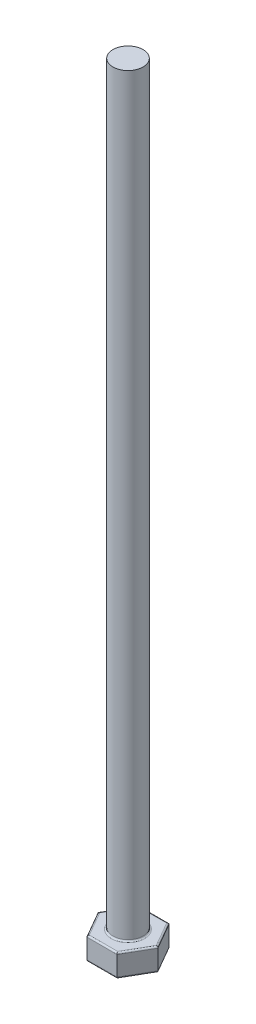
ISO-10303-21;
HEADER;
FILE_DESCRIPTION(('STEP AP214'),'2;1');
FILE_NAME('part.step','',(''),(''),'','','');
FILE_SCHEMA(('AUTOMOTIVE_DESIGN { 1 0 10303 214 1 1 1 1 }'));
ENDSEC;
DATA;
#1=APPLICATION_CONTEXT('core data for automotive mechanical design processes');
#2=APPLICATION_PROTOCOL_DEFINITION('international standard','automotive_design',2000,#1);
#3=PRODUCT_CONTEXT('',#1,'mechanical');
#4=PRODUCT('Part','Part','',(#3));
#5=PRODUCT_RELATED_PRODUCT_CATEGORY('part','',(#4));
#6=PRODUCT_DEFINITION_FORMATION('','',#4);
#7=PRODUCT_DEFINITION_CONTEXT('part definition',#1,'design');
#8=PRODUCT_DEFINITION('design','',#6,#7);
#9=PRODUCT_DEFINITION_SHAPE('','',#8);
#10=(LENGTH_UNIT() NAMED_UNIT(*) SI_UNIT(.MILLI.,.METRE.));
#11=(NAMED_UNIT(*) PLANE_ANGLE_UNIT() SI_UNIT($,.RADIAN.));
#12=(NAMED_UNIT(*) SI_UNIT($,.STERADIAN.) SOLID_ANGLE_UNIT());
#13=UNCERTAINTY_MEASURE_WITH_UNIT(LENGTH_MEASURE(1.E-05),#10,'distance_accuracy_value','');
#14=(GEOMETRIC_REPRESENTATION_CONTEXT(3) GLOBAL_UNCERTAINTY_ASSIGNED_CONTEXT((#13)) GLOBAL_UNIT_ASSIGNED_CONTEXT((#10,
#11,#12)) REPRESENTATION_CONTEXT('',''));
#15=CARTESIAN_POINT('',(0.,0.,0.));
#16=DIRECTION('',(0.,0.,1.));
#17=DIRECTION('',(1.,0.,0.));
#18=AXIS2_PLACEMENT_3D('',#15,#16,#17);
#19=CARTESIAN_POINT('',(0.,100.,0.));
#20=DIRECTION('',(0.,-1.,0.));
#21=DIRECTION('',(0.,0.,-1.));
#22=AXIS2_PLACEMENT_3D('',#19,#20,#21);
#23=CYLINDRICAL_SURFACE('',#22,2.);
#24=CARTESIAN_POINT('',(0.,0.200000000000006,0.));
#25=DIRECTION('',(0.,-1.,0.));
#26=DIRECTION('',(0.,0.,-1.));
#27=AXIS2_PLACEMENT_3D('',#24,#25,#26);
#28=CIRCLE('',#27,2.);
#29=CARTESIAN_POINT('',(0.,0.200000000000006,-2.));
#30=VERTEX_POINT('',#29);
#31=EDGE_CURVE('E11',#30,#30,#28,.F.);
#32=ORIENTED_EDGE('',*,*,#31,.T.);
#33=EDGE_LOOP('',(#32));
#34=FACE_BOUND('',#33,.T.);
#35=CARTESIAN_POINT('',(0.,100.,0.));
#36=DIRECTION('',(0.,1.,0.));
#37=DIRECTION('',(0.,0.,1.));
#38=AXIS2_PLACEMENT_3D('',#35,#36,#37);
#39=CIRCLE('',#38,2.);
#40=CARTESIAN_POINT('',(0.,100.,2.));
#41=VERTEX_POINT('',#40);
#42=EDGE_CURVE('E153',#41,#41,#39,.T.);
#43=ORIENTED_EDGE('',*,*,#42,.F.);
#44=EDGE_LOOP('',(#43));
#45=FACE_BOUND('',#44,.T.);
#46=ADVANCED_FACE('F39',(#34,#45),#23,.T.);
#47=CARTESIAN_POINT('',(0.,100.,0.));
#48=DIRECTION('',(0.,1.,0.));
#49=DIRECTION('',(0.,0.,1.));
#50=AXIS2_PLACEMENT_3D('',#47,#48,#49);
#51=PLANE('',#50);
#52=ORIENTED_EDGE('',*,*,#42,.T.);
#53=EDGE_LOOP('',(#52));
#54=FACE_BOUND('',#53,.T.);
#55=ADVANCED_FACE('F355',(#54),#51,.T.);
#56=CARTESIAN_POINT('',(1.99185842870421,-3.,-3.45));
#57=DIRECTION('',(-0.866025403784439,0.,0.5));
#58=DIRECTION('',(0.5,0.,0.866025403784439));
#59=AXIS2_PLACEMENT_3D('',#56,#57,#58);
#60=PLANE('',#59);
#61=DIRECTION('',(0.,1.,0.));
#62=VECTOR('',#61,1.);
#63=CARTESIAN_POINT('',(3.98371685740842,-3.,0.));
#64=LINE('',#63,#62);
#65=CARTESIAN_POINT('',(3.98371685740842,-2.8,0.));
#66=VERTEX_POINT('',#65);
#67=CARTESIAN_POINT('',(3.98371685740842,-0.2,0.));
#68=VERTEX_POINT('',#67);
#69=EDGE_CURVE('E282',#66,#68,#64,.T.);
#70=ORIENTED_EDGE('',*,*,#69,.F.);
#71=DIRECTION('',(0.5,0.,0.866025403784439));
#72=VECTOR('',#71,1.);
#73=CARTESIAN_POINT('',(1.99185842870421,-2.8,-3.45));
#74=LINE('',#73,#72);
#75=CARTESIAN_POINT('',(1.99185842870421,-2.8,-3.45));
#76=VERTEX_POINT('',#75);
#77=EDGE_CURVE('E199',#66,#76,#74,.F.);
#78=ORIENTED_EDGE('',*,*,#77,.T.);
#79=DIRECTION('',(0.,1.,0.));
#80=VECTOR('',#79,1.);
#81=CARTESIAN_POINT('',(1.99185842870421,-3.,-3.45));
#82=LINE('',#81,#80);
#83=CARTESIAN_POINT('',(1.99185842870421,-0.2,-3.45));
#84=VERTEX_POINT('',#83);
#85=EDGE_CURVE('E237',#76,#84,#82,.T.);
#86=ORIENTED_EDGE('',*,*,#85,.T.);
#87=DIRECTION('',(0.5,0.,0.866025403784439));
#88=VECTOR('',#87,1.);
#89=CARTESIAN_POINT('',(1.99185842870421,-0.2,-3.45));
#90=LINE('',#89,#88);
#91=EDGE_CURVE('E196',#84,#68,#90,.T.);
#92=ORIENTED_EDGE('',*,*,#91,.T.);
#93=EDGE_LOOP('',(#70,#78,#86,#92));
#94=FACE_BOUND('',#93,.T.);
#95=ADVANCED_FACE('F281',(#94),#60,.F.);
#96=CARTESIAN_POINT('',(3.98371685740842,-3.,0.));
#97=DIRECTION('',(-0.866025403784438,0.,-0.5));
#98=DIRECTION('',(-0.5,0.,0.866025403784439));
#99=AXIS2_PLACEMENT_3D('',#96,#97,#98);
#100=PLANE('',#99);
#101=DIRECTION('',(0.,1.,0.));
#102=VECTOR('',#101,1.);
#103=CARTESIAN_POINT('',(1.99185842870421,-3.,3.45));
#104=LINE('',#103,#102);
#105=CARTESIAN_POINT('',(1.99185842870421,-2.8,3.45));
#106=VERTEX_POINT('',#105);
#107=CARTESIAN_POINT('',(1.99185842870421,-0.2,3.45));
#108=VERTEX_POINT('',#107);
#109=EDGE_CURVE('E290',#106,#108,#104,.T.);
#110=ORIENTED_EDGE('',*,*,#109,.F.);
#111=DIRECTION('',(-0.5,0.,0.866025403784439));
#112=VECTOR('',#111,1.);
#113=CARTESIAN_POINT('',(3.98371685740842,-2.8,0.));
#114=LINE('',#113,#112);
#115=EDGE_CURVE('E193',#106,#66,#114,.F.);
#116=ORIENTED_EDGE('',*,*,#115,.T.);
#117=ORIENTED_EDGE('',*,*,#69,.T.);
#118=DIRECTION('',(-0.5,0.,0.866025403784439));
#119=VECTOR('',#118,1.);
#120=CARTESIAN_POINT('',(3.98371685740842,-0.2,0.));
#121=LINE('',#120,#119);
#122=EDGE_CURVE('E189',#68,#108,#121,.T.);
#123=ORIENTED_EDGE('',*,*,#122,.T.);
#124=EDGE_LOOP('',(#110,#116,#117,#123));
#125=FACE_BOUND('',#124,.T.);
#126=ADVANCED_FACE('F286',(#125),#100,.F.);
#127=CARTESIAN_POINT('',(1.99185842870421,-3.,3.45));
#128=DIRECTION('',(0.,0.,-1.));
#129=DIRECTION('',(-1.,0.,0.));
#130=AXIS2_PLACEMENT_3D('',#127,#128,#129);
#131=PLANE('',#130);
#132=DIRECTION('',(0.,1.,0.));
#133=VECTOR('',#132,1.);
#134=CARTESIAN_POINT('',(-1.99185842870421,-3.,3.45));
#135=LINE('',#134,#133);
#136=CARTESIAN_POINT('',(-1.99185842870421,-2.8,3.45));
#137=VERTEX_POINT('',#136);
#138=CARTESIAN_POINT('',(-1.99185842870421,-0.2,3.45));
#139=VERTEX_POINT('',#138);
#140=EDGE_CURVE('E296',#137,#139,#135,.T.);
#141=ORIENTED_EDGE('',*,*,#140,.F.);
#142=DIRECTION('',(-1.,0.,0.));
#143=VECTOR('',#142,1.);
#144=CARTESIAN_POINT('',(1.99185842870421,-2.8,3.45));
#145=LINE('',#144,#143);
#146=EDGE_CURVE('E186',#137,#106,#145,.F.);
#147=ORIENTED_EDGE('',*,*,#146,.T.);
#148=ORIENTED_EDGE('',*,*,#109,.T.);
#149=DIRECTION('',(-1.,0.,0.));
#150=VECTOR('',#149,1.);
#151=CARTESIAN_POINT('',(1.99185842870421,-0.2,3.45));
#152=LINE('',#151,#150);
#153=EDGE_CURVE('E183',#108,#139,#152,.T.);
#154=ORIENTED_EDGE('',*,*,#153,.T.);
#155=EDGE_LOOP('',(#141,#147,#148,#154));
#156=FACE_BOUND('',#155,.T.);
#157=ADVANCED_FACE('F385',(#156),#131,.F.);
#158=CARTESIAN_POINT('',(-1.99185842870421,-3.,3.45));
#159=DIRECTION('',(0.866025403784439,0.,-0.5));
#160=DIRECTION('',(-0.5,0.,-0.866025403784439));
#161=AXIS2_PLACEMENT_3D('',#158,#159,#160);
#162=PLANE('',#161);
#163=DIRECTION('',(0.,1.,0.));
#164=VECTOR('',#163,1.);
#165=CARTESIAN_POINT('',(-3.98371685740842,-3.,0.));
#166=LINE('',#165,#164);
#167=CARTESIAN_POINT('',(-3.98371685740842,-2.8,0.));
#168=VERTEX_POINT('',#167);
#169=CARTESIAN_POINT('',(-3.98371685740842,-0.2,0.));
#170=VERTEX_POINT('',#169);
#171=EDGE_CURVE('E325',#168,#170,#166,.T.);
#172=ORIENTED_EDGE('',*,*,#171,.F.);
#173=DIRECTION('',(-0.5,0.,-0.866025403784439));
#174=VECTOR('',#173,1.);
#175=CARTESIAN_POINT('',(-1.99185842870421,-2.8,3.45));
#176=LINE('',#175,#174);
#177=EDGE_CURVE('E180',#168,#137,#176,.F.);
#178=ORIENTED_EDGE('',*,*,#177,.T.);
#179=ORIENTED_EDGE('',*,*,#140,.T.);
#180=DIRECTION('',(-0.5,0.,-0.866025403784439));
#181=VECTOR('',#180,1.);
#182=CARTESIAN_POINT('',(-1.99185842870421,-0.2,3.45));
#183=LINE('',#182,#181);
#184=EDGE_CURVE('E177',#139,#170,#183,.T.);
#185=ORIENTED_EDGE('',*,*,#184,.T.);
#186=EDGE_LOOP('',(#172,#178,#179,#185));
#187=FACE_BOUND('',#186,.T.);
#188=ADVANCED_FACE('F335',(#187),#162,.F.);
#189=CARTESIAN_POINT('',(-3.98371685740842,-3.,0.));
#190=DIRECTION('',(0.866025403784438,0.,0.5));
#191=DIRECTION('',(0.5,0.,-0.866025403784439));
#192=AXIS2_PLACEMENT_3D('',#189,#190,#191);
#193=PLANE('',#192);
#194=DIRECTION('',(0.,1.,0.));
#195=VECTOR('',#194,1.);
#196=CARTESIAN_POINT('',(-1.99185842870421,-3.,-3.45));
#197=LINE('',#196,#195);
#198=CARTESIAN_POINT('',(-1.99185842870421,-2.8,-3.45));
#199=VERTEX_POINT('',#198);
#200=CARTESIAN_POINT('',(-1.99185842870421,-0.2,-3.45));
#201=VERTEX_POINT('',#200);
#202=EDGE_CURVE('E322',#199,#201,#197,.T.);
#203=ORIENTED_EDGE('',*,*,#202,.F.);
#204=DIRECTION('',(0.5,0.,-0.866025403784439));
#205=VECTOR('',#204,1.);
#206=CARTESIAN_POINT('',(-3.98371685740842,-2.8,0.));
#207=LINE('',#206,#205);
#208=EDGE_CURVE('E174',#199,#168,#207,.F.);
#209=ORIENTED_EDGE('',*,*,#208,.T.);
#210=ORIENTED_EDGE('',*,*,#171,.T.);
#211=DIRECTION('',(0.5,0.,-0.866025403784439));
#212=VECTOR('',#211,1.);
#213=CARTESIAN_POINT('',(-3.98371685740842,-0.2,0.));
#214=LINE('',#213,#212);
#215=EDGE_CURVE('E171',#170,#201,#214,.T.);
#216=ORIENTED_EDGE('',*,*,#215,.T.);
#217=EDGE_LOOP('',(#203,#209,#210,#216));
#218=FACE_BOUND('',#217,.T.);
#219=ADVANCED_FACE('F323',(#218),#193,.F.);
#220=CARTESIAN_POINT('',(-1.99185842870421,-3.,-3.45));
#221=DIRECTION('',(0.,0.,1.));
#222=DIRECTION('',(1.,0.,0.));
#223=AXIS2_PLACEMENT_3D('',#220,#221,#222);
#224=PLANE('',#223);
#225=ORIENTED_EDGE('',*,*,#85,.F.);
#226=DIRECTION('',(1.,0.,0.));
#227=VECTOR('',#226,1.);
#228=CARTESIAN_POINT('',(-1.99185842870421,-2.8,-3.45));
#229=LINE('',#228,#227);
#230=EDGE_CURVE('E138',#76,#199,#229,.F.);
#231=ORIENTED_EDGE('',*,*,#230,.T.);
#232=ORIENTED_EDGE('',*,*,#202,.T.);
#233=DIRECTION('',(1.,0.,0.));
#234=VECTOR('',#233,1.);
#235=CARTESIAN_POINT('',(-1.99185842870421,-0.2,-3.45));
#236=LINE('',#235,#234);
#237=EDGE_CURVE('E160',#201,#84,#236,.T.);
#238=ORIENTED_EDGE('',*,*,#237,.T.);
#239=EDGE_LOOP('',(#225,#231,#232,#238));
#240=FACE_BOUND('',#239,.T.);
#241=ADVANCED_FACE('F321',(#240),#224,.F.);
#242=CARTESIAN_POINT('',(0.,-3.,0.));
#243=DIRECTION('',(0.,-1.,0.));
#244=DIRECTION('',(0.,0.,-1.));
#245=AXIS2_PLACEMENT_3D('',#242,#243,#244);
#246=PLANE('',#245);
#247=DIRECTION('',(0.5,0.,-0.866025403784439));
#248=VECTOR('',#247,1.);
#249=CARTESIAN_POINT('',(-1.81865334794732,-3.,-3.35));
#250=LINE('',#249,#248);
#251=CARTESIAN_POINT('',(-3.75277674973257,-3.,0.));
#252=VERTEX_POINT('',#251);
#253=CARTESIAN_POINT('',(-1.87638837486628,-3.,-3.25));
#254=VERTEX_POINT('',#253);
#255=EDGE_CURVE('E157',#252,#254,#250,.T.);
#256=ORIENTED_EDGE('',*,*,#255,.T.);
#257=DIRECTION('',(1.,0.,0.));
#258=VECTOR('',#257,1.);
#259=CARTESIAN_POINT('',(1.99185842870421,-3.,-3.25));
#260=LINE('',#259,#258);
#261=CARTESIAN_POINT('',(1.87638837486628,-3.,-3.25));
#262=VERTEX_POINT('',#261);
#263=EDGE_CURVE('E136',#254,#262,#260,.T.);
#264=ORIENTED_EDGE('',*,*,#263,.T.);
#265=DIRECTION('',(0.5,0.,0.866025403784439));
#266=VECTOR('',#265,1.);
#267=CARTESIAN_POINT('',(3.81051177665153,-3.,0.100000000000001));
#268=LINE('',#267,#266);
#269=CARTESIAN_POINT('',(3.75277674973257,-3.,0.));
#270=VERTEX_POINT('',#269);
#271=EDGE_CURVE('E145',#262,#270,#268,.T.);
#272=ORIENTED_EDGE('',*,*,#271,.T.);
#273=DIRECTION('',(-0.5,0.,0.866025403784439));
#274=VECTOR('',#273,1.);
#275=CARTESIAN_POINT('',(1.81865334794732,-3.,3.35));
#276=LINE('',#275,#274);
#277=CARTESIAN_POINT('',(1.87638837486628,-3.,3.25));
#278=VERTEX_POINT('',#277);
#279=EDGE_CURVE('E152',#270,#278,#276,.T.);
#280=ORIENTED_EDGE('',*,*,#279,.T.);
#281=DIRECTION('',(-1.,0.,0.));
#282=VECTOR('',#281,1.);
#283=CARTESIAN_POINT('',(-1.99185842870421,-3.,3.25));
#284=LINE('',#283,#282);
#285=CARTESIAN_POINT('',(-1.87638837486628,-3.,3.25));
#286=VERTEX_POINT('',#285);
#287=EDGE_CURVE('E302',#278,#286,#284,.T.);
#288=ORIENTED_EDGE('',*,*,#287,.T.);
#289=DIRECTION('',(-0.5,0.,-0.866025403784439));
#290=VECTOR('',#289,1.);
#291=CARTESIAN_POINT('',(-3.81051177665153,-3.,-0.1));
#292=LINE('',#291,#290);
#293=EDGE_CURVE('E165',#286,#252,#292,.T.);
#294=ORIENTED_EDGE('',*,*,#293,.T.);
#295=EDGE_LOOP('',(#256,#264,#272,#280,#288,#294));
#296=FACE_BOUND('',#295,.T.);
#297=ADVANCED_FACE('F155',(#296),#246,.T.);
#298=CARTESIAN_POINT('',(0.,0.,0.));
#299=DIRECTION('',(0.,-1.,0.));
#300=DIRECTION('',(0.,0.,-1.));
#301=AXIS2_PLACEMENT_3D('',#298,#299,#300);
#302=PLANE('',#301);
#303=DIRECTION('',(-1.,0.,0.));
#304=VECTOR('',#303,1.);
#305=CARTESIAN_POINT('',(0.,0.,3.25));
#306=LINE('',#305,#304);
#307=CARTESIAN_POINT('',(-1.87638837486628,0.,3.25));
#308=VERTEX_POINT('',#307);
#309=CARTESIAN_POINT('',(1.87638837486628,0.,3.25));
#310=VERTEX_POINT('',#309);
#311=EDGE_CURVE('E57',#308,#310,#306,.F.);
#312=ORIENTED_EDGE('',*,*,#311,.T.);
#313=DIRECTION('',(-0.5,0.,0.866025403784439));
#314=VECTOR('',#313,1.);
#315=CARTESIAN_POINT('',(2.81458256229942,0.,1.625));
#316=LINE('',#315,#314);
#317=CARTESIAN_POINT('',(3.75277674973257,0.,0.));
#318=VERTEX_POINT('',#317);
#319=EDGE_CURVE('E49',#310,#318,#316,.F.);
#320=ORIENTED_EDGE('',*,*,#319,.T.);
#321=DIRECTION('',(0.5,0.,0.866025403784439));
#322=VECTOR('',#321,1.);
#323=CARTESIAN_POINT('',(2.81458256229943,0.,-1.625));
#324=LINE('',#323,#322);
#325=CARTESIAN_POINT('',(1.87638837486628,0.,-3.25));
#326=VERTEX_POINT('',#325);
#327=EDGE_CURVE('E206',#318,#326,#324,.F.);
#328=ORIENTED_EDGE('',*,*,#327,.T.);
#329=DIRECTION('',(1.,0.,0.));
#330=VECTOR('',#329,1.);
#331=CARTESIAN_POINT('',(0.,0.,-3.25));
#332=LINE('',#331,#330);
#333=CARTESIAN_POINT('',(-1.87638837486628,0.,-3.25));
#334=VERTEX_POINT('',#333);
#335=EDGE_CURVE('E209',#326,#334,#332,.F.);
#336=ORIENTED_EDGE('',*,*,#335,.T.);
#337=DIRECTION('',(0.5,0.,-0.866025403784439));
#338=VECTOR('',#337,1.);
#339=CARTESIAN_POINT('',(-2.81458256229942,0.,-1.625));
#340=LINE('',#339,#338);
#341=CARTESIAN_POINT('',(-3.75277674973257,0.,0.));
#342=VERTEX_POINT('',#341);
#343=EDGE_CURVE('E212',#334,#342,#340,.F.);
#344=ORIENTED_EDGE('',*,*,#343,.T.);
#345=DIRECTION('',(-0.5,0.,-0.866025403784439));
#346=VECTOR('',#345,1.);
#347=CARTESIAN_POINT('',(-2.81458256229943,0.,1.625));
#348=LINE('',#347,#346);
#349=EDGE_CURVE('E62',#342,#308,#348,.F.);
#350=ORIENTED_EDGE('',*,*,#349,.T.);
#351=EDGE_LOOP('',(#312,#320,#328,#336,#344,#350));
#352=FACE_BOUND('',#351,.T.);
#353=CARTESIAN_POINT('',(0.,0.,0.));
#354=DIRECTION('',(0.,-1.,0.));
#355=DIRECTION('',(0.,0.,-1.));
#356=AXIS2_PLACEMENT_3D('',#353,#354,#355);
#357=CIRCLE('',#356,2.2);
#358=CARTESIAN_POINT('',(0.,0.,-2.2));
#359=VERTEX_POINT('',#358);
#360=EDGE_CURVE('E202',#359,#359,#357,.T.);
#361=ORIENTED_EDGE('',*,*,#360,.T.);
#362=EDGE_LOOP('',(#361));
#363=FACE_BOUND('',#362,.T.);
#364=ADVANCED_FACE('F269',(#352,#363),#302,.F.);
#365=CARTESIAN_POINT('',(0.,-2.8,3.25));
#366=DIRECTION('',(1.,0.,0.));
#367=DIRECTION('',(0.,0.,-1.));
#368=AXIS2_PLACEMENT_3D('',#365,#366,#367);
#369=CYLINDRICAL_SURFACE('',#368,0.2);
#370=CARTESIAN_POINT('',(1.87638837486628,-2.8,3.25));
#371=DIRECTION('',(0.866025403784439,0.,-0.5));
#372=DIRECTION('',(-0.5,0.,-0.866025403784439));
#373=AXIS2_PLACEMENT_3D('',#370,#371,#372);
#374=ELLIPSE('',#373,0.23094010767585,0.2);
#375=EDGE_CURVE('E229',#106,#278,#374,.T.);
#376=ORIENTED_EDGE('',*,*,#375,.F.);
#377=ORIENTED_EDGE('',*,*,#146,.F.);
#378=CARTESIAN_POINT('',(-1.87638837486628,-2.8,3.25));
#379=DIRECTION('',(0.866025403784439,0.,0.5));
#380=DIRECTION('',(0.5,0.,-0.866025403784439));
#381=AXIS2_PLACEMENT_3D('',#378,#379,#380);
#382=ELLIPSE('',#381,0.23094010767585,0.2);
#383=EDGE_CURVE('E233',#286,#137,#382,.F.);
#384=ORIENTED_EDGE('',*,*,#383,.F.);
#385=ORIENTED_EDGE('',*,*,#287,.F.);
#386=EDGE_LOOP('',(#376,#377,#384,#385));
#387=FACE_BOUND('',#386,.T.);
#388=ADVANCED_FACE('F377',(#387),#369,.T.);
#389=CARTESIAN_POINT('',(-2.81458256229943,-2.8,1.625));
#390=DIRECTION('',(0.5,0.,0.866025403784439));
#391=DIRECTION('',(0.866025403784439,0.,-0.5));
#392=AXIS2_PLACEMENT_3D('',#389,#390,#391);
#393=CYLINDRICAL_SURFACE('',#392,0.2);
#394=ORIENTED_EDGE('',*,*,#383,.T.);
#395=ORIENTED_EDGE('',*,*,#177,.F.);
#396=CARTESIAN_POINT('',(-3.75277674973257,-2.8,0.));
#397=DIRECTION('',(0.,0.,1.));
#398=DIRECTION('',(1.,0.,0.));
#399=AXIS2_PLACEMENT_3D('',#396,#397,#398);
#400=ELLIPSE('',#399,0.23094010767585,0.2);
#401=EDGE_CURVE('E225',#252,#168,#400,.F.);
#402=ORIENTED_EDGE('',*,*,#401,.F.);
#403=ORIENTED_EDGE('',*,*,#293,.F.);
#404=EDGE_LOOP('',(#394,#395,#402,#403));
#405=FACE_BOUND('',#404,.T.);
#406=ADVANCED_FACE('F311',(#405),#393,.T.);
#407=CARTESIAN_POINT('',(2.81458256229942,-2.8,1.625));
#408=DIRECTION('',(0.5,0.,-0.866025403784439));
#409=DIRECTION('',(-0.866025403784438,0.,-0.5));
#410=AXIS2_PLACEMENT_3D('',#407,#408,#409);
#411=CYLINDRICAL_SURFACE('',#410,0.2);
#412=ORIENTED_EDGE('',*,*,#375,.T.);
#413=ORIENTED_EDGE('',*,*,#279,.F.);
#414=CARTESIAN_POINT('',(3.75277674973257,-2.8,0.));
#415=DIRECTION('',(0.,0.,-1.));
#416=DIRECTION('',(-1.,0.,0.));
#417=AXIS2_PLACEMENT_3D('',#414,#415,#416);
#418=ELLIPSE('',#417,0.23094010767585,0.2);
#419=EDGE_CURVE('E148',#66,#270,#418,.T.);
#420=ORIENTED_EDGE('',*,*,#419,.F.);
#421=ORIENTED_EDGE('',*,*,#115,.F.);
#422=EDGE_LOOP('',(#412,#413,#420,#421));
#423=FACE_BOUND('',#422,.T.);
#424=ADVANCED_FACE('F372',(#423),#411,.T.);
#425=CARTESIAN_POINT('',(-2.81458256229942,-2.8,-1.625));
#426=DIRECTION('',(-0.5,0.,0.866025403784439));
#427=DIRECTION('',(0.866025403784438,0.,0.5));
#428=AXIS2_PLACEMENT_3D('',#425,#426,#427);
#429=CYLINDRICAL_SURFACE('',#428,0.2);
#430=ORIENTED_EDGE('',*,*,#401,.T.);
#431=ORIENTED_EDGE('',*,*,#208,.F.);
#432=CARTESIAN_POINT('',(-1.87638837486628,-2.8,-3.25));
#433=DIRECTION('',(-0.866025403784439,0.,0.5));
#434=DIRECTION('',(0.5,0.,0.866025403784439));
#435=AXIS2_PLACEMENT_3D('',#432,#433,#434);
#436=ELLIPSE('',#435,0.23094010767585,0.2);
#437=EDGE_CURVE('E142',#254,#199,#436,.F.);
#438=ORIENTED_EDGE('',*,*,#437,.F.);
#439=ORIENTED_EDGE('',*,*,#255,.F.);
#440=EDGE_LOOP('',(#430,#431,#438,#439));
#441=FACE_BOUND('',#440,.T.);
#442=ADVANCED_FACE('F314',(#441),#429,.T.);
#443=CARTESIAN_POINT('',(2.81458256229943,-2.8,-1.625));
#444=DIRECTION('',(-0.5,0.,-0.866025403784439));
#445=DIRECTION('',(-0.866025403784439,0.,0.5));
#446=AXIS2_PLACEMENT_3D('',#443,#444,#445);
#447=CYLINDRICAL_SURFACE('',#446,0.2);
#448=ORIENTED_EDGE('',*,*,#419,.T.);
#449=ORIENTED_EDGE('',*,*,#271,.F.);
#450=CARTESIAN_POINT('',(1.87638837486628,-2.8,-3.25));
#451=DIRECTION('',(-0.866025403784439,0.,-0.5));
#452=DIRECTION('',(0.5,0.,-0.866025403784439));
#453=AXIS2_PLACEMENT_3D('',#450,#451,#452);
#454=ELLIPSE('',#453,0.23094010767585,0.2);
#455=EDGE_CURVE('E132',#76,#262,#454,.T.);
#456=ORIENTED_EDGE('',*,*,#455,.F.);
#457=ORIENTED_EDGE('',*,*,#77,.F.);
#458=EDGE_LOOP('',(#448,#449,#456,#457));
#459=FACE_BOUND('',#458,.T.);
#460=ADVANCED_FACE('F146',(#459),#447,.T.);
#461=CARTESIAN_POINT('',(0.,-2.8,-3.25));
#462=DIRECTION('',(-1.,0.,0.));
#463=DIRECTION('',(0.,0.,1.));
#464=AXIS2_PLACEMENT_3D('',#461,#462,#463);
#465=CYLINDRICAL_SURFACE('',#464,0.2);
#466=ORIENTED_EDGE('',*,*,#437,.T.);
#467=ORIENTED_EDGE('',*,*,#230,.F.);
#468=ORIENTED_EDGE('',*,*,#455,.T.);
#469=ORIENTED_EDGE('',*,*,#263,.F.);
#470=EDGE_LOOP('',(#466,#467,#468,#469));
#471=FACE_BOUND('',#470,.T.);
#472=ADVANCED_FACE('F134',(#471),#465,.T.);
#473=CARTESIAN_POINT('',(-3.81051177665153,-0.2,0.1));
#474=DIRECTION('',(0.5,0.,-0.866025403784439));
#475=DIRECTION('',(-0.866025403784438,0.,-0.5));
#476=AXIS2_PLACEMENT_3D('',#473,#474,#475);
#477=CYLINDRICAL_SURFACE('',#476,0.2);
#478=CARTESIAN_POINT('',(-3.75277674973257,-0.2,0.));
#479=DIRECTION('',(0.,0.,-1.));
#480=DIRECTION('',(1.,0.,0.));
#481=AXIS2_PLACEMENT_3D('',#478,#479,#480);
#482=ELLIPSE('',#481,0.23094010767585,0.2);
#483=EDGE_CURVE('E251',#342,#170,#482,.F.);
#484=ORIENTED_EDGE('',*,*,#483,.F.);
#485=ORIENTED_EDGE('',*,*,#343,.F.);
#486=CARTESIAN_POINT('',(-1.87638837486628,-0.2,-3.25));
#487=DIRECTION('',(0.866025403784439,0.,-0.5));
#488=DIRECTION('',(0.5,0.,0.866025403784439));
#489=AXIS2_PLACEMENT_3D('',#486,#487,#488);
#490=ELLIPSE('',#489,0.23094010767585,0.2);
#491=EDGE_CURVE('E43',#201,#334,#490,.T.);
#492=ORIENTED_EDGE('',*,*,#491,.F.);
#493=ORIENTED_EDGE('',*,*,#215,.F.);
#494=EDGE_LOOP('',(#484,#485,#492,#493));
#495=FACE_BOUND('',#494,.T.);
#496=ADVANCED_FACE('F268',(#495),#477,.T.);
#497=CARTESIAN_POINT('',(-1.99185842870421,-0.2,-3.25));
#498=DIRECTION('',(1.,0.,0.));
#499=DIRECTION('',(0.,0.,-1.));
#500=AXIS2_PLACEMENT_3D('',#497,#498,#499);
#501=CYLINDRICAL_SURFACE('',#500,0.2);
#502=ORIENTED_EDGE('',*,*,#491,.T.);
#503=ORIENTED_EDGE('',*,*,#335,.F.);
#504=CARTESIAN_POINT('',(1.87638837486628,-0.2,-3.25));
#505=DIRECTION('',(0.866025403784439,0.,0.5));
#506=DIRECTION('',(-0.5,0.,0.866025403784439));
#507=AXIS2_PLACEMENT_3D('',#504,#505,#506);
#508=ELLIPSE('',#507,0.23094010767585,0.2);
#509=EDGE_CURVE('E248',#84,#326,#508,.T.);
#510=ORIENTED_EDGE('',*,*,#509,.F.);
#511=ORIENTED_EDGE('',*,*,#237,.F.);
#512=EDGE_LOOP('',(#502,#503,#510,#511));
#513=FACE_BOUND('',#512,.T.);
#514=ADVANCED_FACE('F263',(#513),#501,.T.);
#515=CARTESIAN_POINT('',(-1.81865334794732,-0.2,3.35));
#516=DIRECTION('',(-0.5,0.,-0.866025403784439));
#517=DIRECTION('',(-0.866025403784439,0.,0.5));
#518=AXIS2_PLACEMENT_3D('',#515,#516,#517);
#519=CYLINDRICAL_SURFACE('',#518,0.2);
#520=ORIENTED_EDGE('',*,*,#483,.T.);
#521=ORIENTED_EDGE('',*,*,#184,.F.);
#522=CARTESIAN_POINT('',(-1.87638837486628,-0.2,3.25));
#523=DIRECTION('',(-0.866025403784439,0.,-0.5));
#524=DIRECTION('',(0.5,0.,-0.866025403784439));
#525=AXIS2_PLACEMENT_3D('',#522,#523,#524);
#526=ELLIPSE('',#525,0.23094010767585,0.2);
#527=EDGE_CURVE('E244',#308,#139,#526,.F.);
#528=ORIENTED_EDGE('',*,*,#527,.F.);
#529=ORIENTED_EDGE('',*,*,#349,.F.);
#530=EDGE_LOOP('',(#520,#521,#528,#529));
#531=FACE_BOUND('',#530,.T.);
#532=ADVANCED_FACE('F338',(#531),#519,.T.);
#533=CARTESIAN_POINT('',(1.81865334794732,-0.2,-3.35));
#534=DIRECTION('',(0.5,0.,0.866025403784439));
#535=DIRECTION('',(0.866025403784439,0.,-0.5));
#536=AXIS2_PLACEMENT_3D('',#533,#534,#535);
#537=CYLINDRICAL_SURFACE('',#536,0.2);
#538=ORIENTED_EDGE('',*,*,#509,.T.);
#539=ORIENTED_EDGE('',*,*,#327,.F.);
#540=CARTESIAN_POINT('',(3.75277674973257,-0.2,0.));
#541=DIRECTION('',(0.,0.,1.));
#542=DIRECTION('',(1.,0.,0.));
#543=AXIS2_PLACEMENT_3D('',#540,#541,#542);
#544=ELLIPSE('',#543,0.23094010767585,0.2);
#545=EDGE_CURVE('E241',#68,#318,#544,.T.);
#546=ORIENTED_EDGE('',*,*,#545,.F.);
#547=ORIENTED_EDGE('',*,*,#91,.F.);
#548=EDGE_LOOP('',(#538,#539,#546,#547));
#549=FACE_BOUND('',#548,.T.);
#550=ADVANCED_FACE('F274',(#549),#537,.T.);
#551=CARTESIAN_POINT('',(1.99185842870421,-0.2,3.25));
#552=DIRECTION('',(-1.,0.,0.));
#553=DIRECTION('',(0.,0.,1.));
#554=AXIS2_PLACEMENT_3D('',#551,#552,#553);
#555=CYLINDRICAL_SURFACE('',#554,0.2);
#556=ORIENTED_EDGE('',*,*,#527,.T.);
#557=ORIENTED_EDGE('',*,*,#153,.F.);
#558=CARTESIAN_POINT('',(1.87638837486628,-0.2,3.25));
#559=DIRECTION('',(-0.866025403784439,0.,0.5));
#560=DIRECTION('',(-0.5,0.,-0.866025403784439));
#561=AXIS2_PLACEMENT_3D('',#558,#559,#560);
#562=ELLIPSE('',#561,0.23094010767585,0.2);
#563=EDGE_CURVE('E238',#310,#108,#562,.F.);
#564=ORIENTED_EDGE('',*,*,#563,.F.);
#565=ORIENTED_EDGE('',*,*,#311,.F.);
#566=EDGE_LOOP('',(#556,#557,#564,#565));
#567=FACE_BOUND('',#566,.T.);
#568=ADVANCED_FACE('F341',(#567),#555,.T.);
#569=CARTESIAN_POINT('',(3.81051177665153,-0.2,-0.0999999999999996));
#570=DIRECTION('',(-0.5,0.,0.866025403784439));
#571=DIRECTION('',(0.866025403784438,0.,0.5));
#572=AXIS2_PLACEMENT_3D('',#569,#570,#571);
#573=CYLINDRICAL_SURFACE('',#572,0.2);
#574=ORIENTED_EDGE('',*,*,#545,.T.);
#575=ORIENTED_EDGE('',*,*,#319,.F.);
#576=ORIENTED_EDGE('',*,*,#563,.T.);
#577=ORIENTED_EDGE('',*,*,#122,.F.);
#578=EDGE_LOOP('',(#574,#575,#576,#577));
#579=FACE_BOUND('',#578,.T.);
#580=ADVANCED_FACE('F344',(#579),#573,.T.);
#581=CARTESIAN_POINT('',(0.,0.200000000000006,0.));
#582=DIRECTION('',(0.,-1.,0.));
#583=DIRECTION('',(0.,0.,-1.));
#584=AXIS2_PLACEMENT_3D('',#581,#582,#583);
#585=TOROIDAL_SURFACE('',#584,2.2,0.2);
#586=ORIENTED_EDGE('',*,*,#360,.F.);
#587=EDGE_LOOP('',(#586));
#588=FACE_BOUND('',#587,.T.);
#589=ORIENTED_EDGE('',*,*,#31,.F.);
#590=EDGE_LOOP('',(#589));
#591=FACE_BOUND('',#590,.T.);
#592=ADVANCED_FACE('F41',(#588,#591),#585,.F.);
#593=CLOSED_SHELL('',(#46,#55,#95,#126,#157,#188,#219,#241,#297,#364,#388,#406,#424,#442,#460,
#472,#496,#514,#532,#550,#568,#580,#592));
#594=MANIFOLD_SOLID_BREP('B2',#593);
#595=ADVANCED_BREP_SHAPE_REPRESENTATION('',(#18,#594),#14);
#596=SHAPE_DEFINITION_REPRESENTATION(#9,#595);
ENDSEC;
END-ISO-10303-21;
